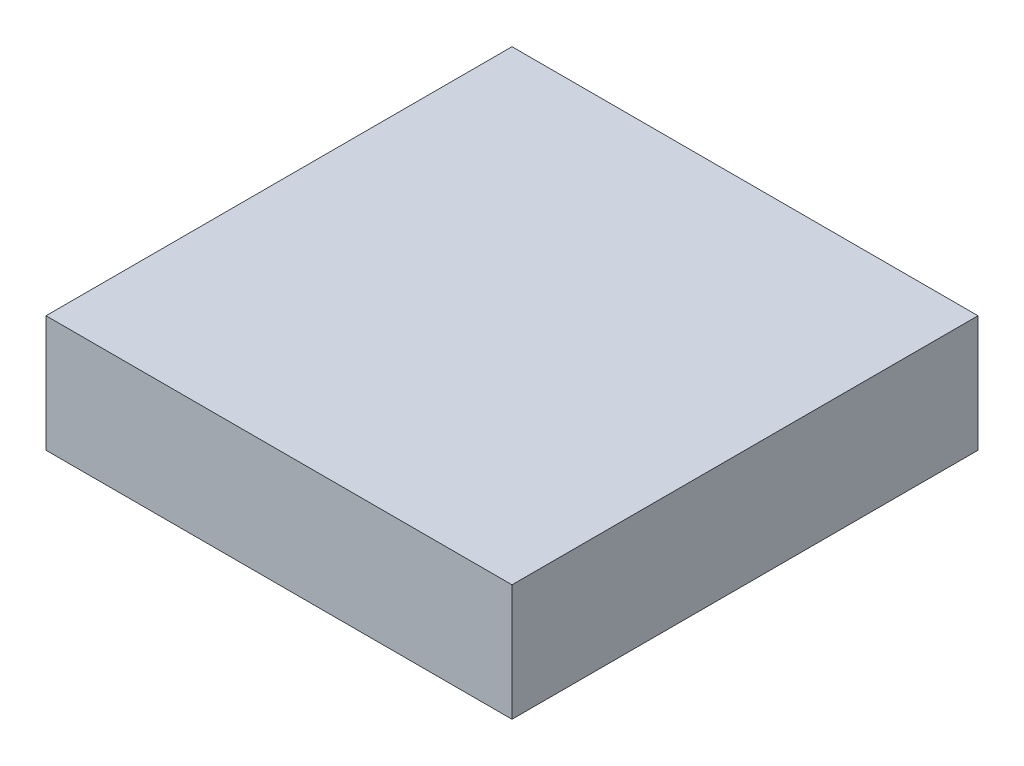
ISO-10303-21;
HEADER;
FILE_DESCRIPTION(('STEP AP214'),'2;1');
FILE_NAME('part.step','',(''),(''),'','','');
FILE_SCHEMA(('AUTOMOTIVE_DESIGN { 1 0 10303 214 1 1 1 1 }'));
ENDSEC;
DATA;
#1=APPLICATION_CONTEXT('core data for automotive mechanical design processes');
#2=APPLICATION_PROTOCOL_DEFINITION('international standard','automotive_design',2000,#1);
#3=PRODUCT_CONTEXT('',#1,'mechanical');
#4=PRODUCT('Part','Part','',(#3));
#5=PRODUCT_RELATED_PRODUCT_CATEGORY('part','',(#4));
#6=PRODUCT_DEFINITION_FORMATION('','',#4);
#7=PRODUCT_DEFINITION_CONTEXT('part definition',#1,'design');
#8=PRODUCT_DEFINITION('design','',#6,#7);
#9=PRODUCT_DEFINITION_SHAPE('','',#8);
#10=(LENGTH_UNIT() NAMED_UNIT(*) SI_UNIT(.MILLI.,.METRE.));
#11=(NAMED_UNIT(*) PLANE_ANGLE_UNIT() SI_UNIT($,.RADIAN.));
#12=(NAMED_UNIT(*) SI_UNIT($,.STERADIAN.) SOLID_ANGLE_UNIT());
#13=UNCERTAINTY_MEASURE_WITH_UNIT(LENGTH_MEASURE(1.E-05),#10,'distance_accuracy_value','');
#14=(GEOMETRIC_REPRESENTATION_CONTEXT(3) GLOBAL_UNCERTAINTY_ASSIGNED_CONTEXT((#13)) GLOBAL_UNIT_ASSIGNED_CONTEXT((#10,
#11,#12)) REPRESENTATION_CONTEXT('',''));
#15=CARTESIAN_POINT('',(0.,0.,0.));
#16=DIRECTION('',(0.,0.,1.));
#17=DIRECTION('',(1.,0.,0.));
#18=AXIS2_PLACEMENT_3D('',#15,#16,#17);
#19=CARTESIAN_POINT('',(1.5,0.75,1.5));
#20=DIRECTION('',(-1.,0.,0.));
#21=DIRECTION('',(0.,0.,1.));
#22=AXIS2_PLACEMENT_3D('',#19,#20,#21);
#23=PLANE('',#22);
#24=DIRECTION('',(0.,0.,-1.));
#25=VECTOR('',#24,1.);
#26=CARTESIAN_POINT('',(1.5,0.,1.5));
#27=LINE('',#26,#25);
#28=CARTESIAN_POINT('',(1.5,0.,1.5));
#29=VERTEX_POINT('',#28);
#30=CARTESIAN_POINT('',(1.5,0.,-1.5));
#31=VERTEX_POINT('',#30);
#32=EDGE_CURVE('E96',#29,#31,#27,.T.);
#33=ORIENTED_EDGE('',*,*,#32,.T.);
#34=DIRECTION('',(0.,-1.,0.));
#35=VECTOR('',#34,1.);
#36=CARTESIAN_POINT('',(1.5,0.75,-1.5));
#37=LINE('',#36,#35);
#38=CARTESIAN_POINT('',(1.5,0.75,-1.5));
#39=VERTEX_POINT('',#38);
#40=EDGE_CURVE('E11',#39,#31,#37,.T.);
#41=ORIENTED_EDGE('',*,*,#40,.F.);
#42=DIRECTION('',(0.,0.,-1.));
#43=VECTOR('',#42,1.);
#44=CARTESIAN_POINT('',(1.5,0.75,1.5));
#45=LINE('',#44,#43);
#46=CARTESIAN_POINT('',(1.5,0.75,1.5));
#47=VERTEX_POINT('',#46);
#48=EDGE_CURVE('E84',#47,#39,#45,.T.);
#49=ORIENTED_EDGE('',*,*,#48,.F.);
#50=DIRECTION('',(0.,-1.,0.));
#51=VECTOR('',#50,1.);
#52=CARTESIAN_POINT('',(1.5,0.75,1.5));
#53=LINE('',#52,#51);
#54=EDGE_CURVE('E92',#47,#29,#53,.T.);
#55=ORIENTED_EDGE('',*,*,#54,.T.);
#56=EDGE_LOOP('',(#33,#41,#49,#55));
#57=FACE_BOUND('',#56,.T.);
#58=ADVANCED_FACE('F33',(#57),#23,.F.);
#59=CARTESIAN_POINT('',(-1.5,0.75,-1.5));
#60=DIRECTION('',(0.,0.,1.));
#61=DIRECTION('',(1.,0.,0.));
#62=AXIS2_PLACEMENT_3D('',#59,#60,#61);
#63=PLANE('',#62);
#64=DIRECTION('',(-1.,0.,0.));
#65=VECTOR('',#64,1.);
#66=CARTESIAN_POINT('',(-1.5,0.,-1.5));
#67=LINE('',#66,#65);
#68=CARTESIAN_POINT('',(-1.5,0.,-1.5));
#69=VERTEX_POINT('',#68);
#70=EDGE_CURVE('E88',#31,#69,#67,.T.);
#71=ORIENTED_EDGE('',*,*,#70,.T.);
#72=DIRECTION('',(0.,-1.,0.));
#73=VECTOR('',#72,1.);
#74=CARTESIAN_POINT('',(-1.5,0.75,-1.5));
#75=LINE('',#74,#73);
#76=CARTESIAN_POINT('',(-1.5,0.75,-1.5));
#77=VERTEX_POINT('',#76);
#78=EDGE_CURVE('E41',#77,#69,#75,.T.);
#79=ORIENTED_EDGE('',*,*,#78,.F.);
#80=DIRECTION('',(-1.,0.,0.));
#81=VECTOR('',#80,1.);
#82=CARTESIAN_POINT('',(-1.5,0.75,-1.5));
#83=LINE('',#82,#81);
#84=EDGE_CURVE('E79',#39,#77,#83,.T.);
#85=ORIENTED_EDGE('',*,*,#84,.F.);
#86=ORIENTED_EDGE('',*,*,#40,.T.);
#87=EDGE_LOOP('',(#71,#79,#85,#86));
#88=FACE_BOUND('',#87,.T.);
#89=ADVANCED_FACE('F87',(#88),#63,.F.);
#90=CARTESIAN_POINT('',(-1.5,0.75,1.5));
#91=DIRECTION('',(1.,0.,0.));
#92=DIRECTION('',(0.,0.,-1.));
#93=AXIS2_PLACEMENT_3D('',#90,#91,#92);
#94=PLANE('',#93);
#95=DIRECTION('',(0.,0.,1.));
#96=VECTOR('',#95,1.);
#97=CARTESIAN_POINT('',(-1.5,0.,1.5));
#98=LINE('',#97,#96);
#99=CARTESIAN_POINT('',(-1.5,0.,1.5));
#100=VERTEX_POINT('',#99);
#101=EDGE_CURVE('E66',#69,#100,#98,.T.);
#102=ORIENTED_EDGE('',*,*,#101,.T.);
#103=DIRECTION('',(0.,-1.,0.));
#104=VECTOR('',#103,1.);
#105=CARTESIAN_POINT('',(-1.5,0.75,1.5));
#106=LINE('',#105,#104);
#107=CARTESIAN_POINT('',(-1.5,0.75,1.5));
#108=VERTEX_POINT('',#107);
#109=EDGE_CURVE('E89',#108,#100,#106,.T.);
#110=ORIENTED_EDGE('',*,*,#109,.F.);
#111=DIRECTION('',(0.,0.,1.));
#112=VECTOR('',#111,1.);
#113=CARTESIAN_POINT('',(-1.5,0.75,1.5));
#114=LINE('',#113,#112);
#115=EDGE_CURVE('E82',#77,#108,#114,.T.);
#116=ORIENTED_EDGE('',*,*,#115,.F.);
#117=ORIENTED_EDGE('',*,*,#78,.T.);
#118=EDGE_LOOP('',(#102,#110,#116,#117));
#119=FACE_BOUND('',#118,.T.);
#120=ADVANCED_FACE('F90',(#119),#94,.F.);
#121=CARTESIAN_POINT('',(-1.5,0.75,1.5));
#122=DIRECTION('',(0.,0.,-1.));
#123=DIRECTION('',(-1.,0.,0.));
#124=AXIS2_PLACEMENT_3D('',#121,#122,#123);
#125=PLANE('',#124);
#126=DIRECTION('',(1.,0.,0.));
#127=VECTOR('',#126,1.);
#128=CARTESIAN_POINT('',(-1.5,0.,1.5));
#129=LINE('',#128,#127);
#130=EDGE_CURVE('E72',#100,#29,#129,.T.);
#131=ORIENTED_EDGE('',*,*,#130,.T.);
#132=ORIENTED_EDGE('',*,*,#54,.F.);
#133=DIRECTION('',(1.,0.,0.));
#134=VECTOR('',#133,1.);
#135=CARTESIAN_POINT('',(-1.5,0.75,1.5));
#136=LINE('',#135,#134);
#137=EDGE_CURVE('E49',#108,#47,#136,.T.);
#138=ORIENTED_EDGE('',*,*,#137,.F.);
#139=ORIENTED_EDGE('',*,*,#109,.T.);
#140=EDGE_LOOP('',(#131,#132,#138,#139));
#141=FACE_BOUND('',#140,.T.);
#142=ADVANCED_FACE('F103',(#141),#125,.F.);
#143=CARTESIAN_POINT('',(0.,0.75,0.));
#144=DIRECTION('',(0.,-1.,0.));
#145=DIRECTION('',(0.,0.,-1.));
#146=AXIS2_PLACEMENT_3D('',#143,#144,#145);
#147=PLANE('',#146);
#148=ORIENTED_EDGE('',*,*,#48,.T.);
#149=ORIENTED_EDGE('',*,*,#84,.T.);
#150=ORIENTED_EDGE('',*,*,#115,.T.);
#151=ORIENTED_EDGE('',*,*,#137,.T.);
#152=EDGE_LOOP('',(#148,#149,#150,#151));
#153=FACE_BOUND('',#152,.T.);
#154=ADVANCED_FACE('F80',(#153),#147,.F.);
#155=CARTESIAN_POINT('',(0.,0.,0.));
#156=DIRECTION('',(0.,-1.,0.));
#157=DIRECTION('',(0.,0.,-1.));
#158=AXIS2_PLACEMENT_3D('',#155,#156,#157);
#159=PLANE('',#158);
#160=ORIENTED_EDGE('',*,*,#32,.F.);
#161=ORIENTED_EDGE('',*,*,#130,.F.);
#162=ORIENTED_EDGE('',*,*,#101,.F.);
#163=ORIENTED_EDGE('',*,*,#70,.F.);
#164=EDGE_LOOP('',(#160,#161,#162,#163));
#165=FACE_BOUND('',#164,.T.);
#166=ADVANCED_FACE('F106',(#165),#159,.T.);
#167=CLOSED_SHELL('',(#58,#89,#120,#142,#154,#166));
#168=MANIFOLD_SOLID_BREP('B2',#167);
#169=ADVANCED_BREP_SHAPE_REPRESENTATION('',(#18,#168),#14);
#170=SHAPE_DEFINITION_REPRESENTATION(#9,#169);
ENDSEC;
END-ISO-10303-21;
